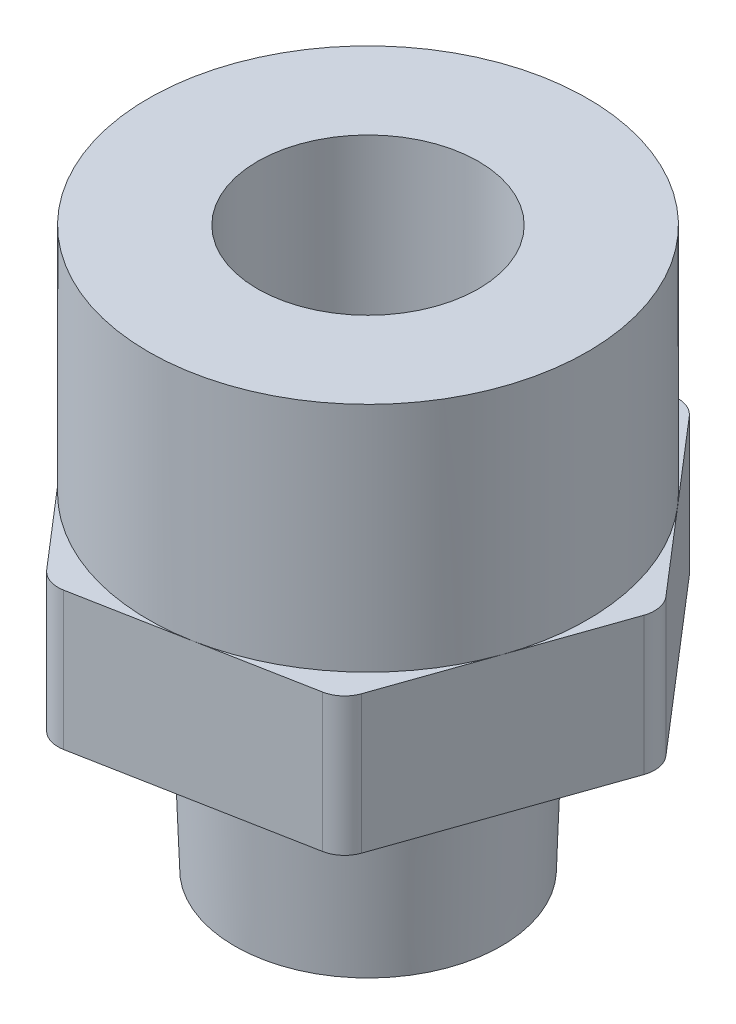
ISO-10303-21;
HEADER;
FILE_DESCRIPTION(('STEP AP214'),'2;1');
FILE_NAME('part.step','',(''),(''),'','','');
FILE_SCHEMA(('AUTOMOTIVE_DESIGN { 1 0 10303 214 1 1 1 1 }'));
ENDSEC;
DATA;
#1=APPLICATION_CONTEXT('core data for automotive mechanical design processes');
#2=APPLICATION_PROTOCOL_DEFINITION('international standard','automotive_design',2000,#1);
#3=PRODUCT_CONTEXT('',#1,'mechanical');
#4=PRODUCT('Part','Part','',(#3));
#5=PRODUCT_RELATED_PRODUCT_CATEGORY('part','',(#4));
#6=PRODUCT_DEFINITION_FORMATION('','',#4);
#7=PRODUCT_DEFINITION_CONTEXT('part definition',#1,'design');
#8=PRODUCT_DEFINITION('design','',#6,#7);
#9=PRODUCT_DEFINITION_SHAPE('','',#8);
#10=(LENGTH_UNIT() NAMED_UNIT(*) SI_UNIT(.MILLI.,.METRE.));
#11=(NAMED_UNIT(*) PLANE_ANGLE_UNIT() SI_UNIT($,.RADIAN.));
#12=(NAMED_UNIT(*) SI_UNIT($,.STERADIAN.) SOLID_ANGLE_UNIT());
#13=UNCERTAINTY_MEASURE_WITH_UNIT(LENGTH_MEASURE(1.E-05),#10,'distance_accuracy_value','');
#14=(GEOMETRIC_REPRESENTATION_CONTEXT(3) GLOBAL_UNCERTAINTY_ASSIGNED_CONTEXT((#13)) GLOBAL_UNIT_ASSIGNED_CONTEXT((#10,
#11,#12)) REPRESENTATION_CONTEXT('',''));
#15=CARTESIAN_POINT('',(0.,0.,0.));
#16=DIRECTION('',(0.,0.,1.));
#17=DIRECTION('',(1.,0.,0.));
#18=AXIS2_PLACEMENT_3D('',#15,#16,#17);
#19=CARTESIAN_POINT('',(0.,12.7,0.));
#20=DIRECTION('',(0.,1.,0.));
#21=DIRECTION('',(0.,0.,1.));
#22=AXIS2_PLACEMENT_3D('',#19,#20,#21);
#23=PLANE('',#22);
#24=DIRECTION('',(0.982547848172458,0.,-0.186010015998258));
#25=VECTOR('',#24,1.);
#26=CARTESIAN_POINT('',(-7.69886897270267,12.7,22.0091741903497));
#27=LINE('',#26,#25);
#28=CARTESIAN_POINT('',(3.75610025305283,12.7,19.8405886981465));
#29=VERTEX_POINT('',#28);
#30=CARTESIAN_POINT('',(13.7701928466378,12.7,17.9447812552769));
#31=VERTEX_POINT('',#30);
#32=EDGE_CURVE('E157',#29,#31,#27,.T.);
#33=ORIENTED_EDGE('',*,*,#32,.T.);
#34=CARTESIAN_POINT('',(13.2977274060023,12.7,15.4491097209189));
#35=DIRECTION('',(0.,1.,0.));
#36=DIRECTION('',(0.,0.,1.));
#37=AXIS2_PLACEMENT_3D('',#34,#35,#36);
#38=CIRCLE('',#37,2.54);
#39=CARTESIAN_POINT('',(15.6952750745758,12.7,16.2877784140973));
#40=VERTEX_POINT('',#39);
#41=EDGE_CURVE('E248',#31,#40,#38,.T.);
#42=ORIENTED_EDGE('',*,*,#41,.T.);
#43=DIRECTION('',(0.330184524873388,0.,-0.943916404950213));
#44=VECTOR('',#43,1.);
#45=CARTESIAN_POINT('',(15.2110694788083,12.7,17.6720032059432));
#46=LINE('',#45,#44);
#47=CARTESIAN_POINT('',(19.0605039651597,12.7,6.66741611076832));
#48=VERTEX_POINT('',#47);
#49=EDGE_CURVE('E171',#40,#48,#46,.T.);
#50=ORIENTED_EDGE('',*,*,#49,.T.);
#51=CARTESIAN_POINT('',(0.,12.7,0.));
#52=DIRECTION('',(0.,1.,0.));
#53=DIRECTION('',(0.,0.,1.));
#54=AXIS2_PLACEMENT_3D('',#51,#52,#53);
#55=CIRCLE('',#54,20.193);
#56=EDGE_CURVE('E169',#29,#48,#55,.T.);
#57=ORIENTED_EDGE('',*,*,#56,.F.);
#58=EDGE_LOOP('',(#33,#42,#50,#57));
#59=FACE_BOUND('',#58,.T.);
#60=ADVANCED_FACE('F36',(#59),#23,.T.);
#61=CARTESIAN_POINT('',(22.4257328557435,12.7,-2.95294619256065));
#62=VERTEX_POINT('',#61);
#63=EDGE_CURVE('E156',#48,#62,#46,.T.);
#64=ORIENTED_EDGE('',*,*,#63,.T.);
#65=CARTESIAN_POINT('',(20.02818518717,12.7,-3.79161488573905));
#66=DIRECTION('',(0.,1.,0.));
#67=DIRECTION('',(0.,0.,1.));
#68=AXIS2_PLACEMENT_3D('',#65,#66,#67);
#69=CIRCLE('',#68,2.54);
#70=CARTESIAN_POINT('',(21.953267415108,12.7,-5.44861772691869));
#71=VERTEX_POINT('',#70);
#72=EDGE_CURVE('E255',#62,#71,#69,.T.);
#73=ORIENTED_EDGE('',*,*,#72,.T.);
#74=DIRECTION('',(-0.65236332329907,0.,-0.757906388951956));
#75=VECTOR('',#74,1.);
#76=CARTESIAN_POINT('',(22.909938451511,12.7,-4.33717098440654));
#77=LINE('',#76,#75);
#78=CARTESIAN_POINT('',(15.3044037121068,12.7,-13.1731725873781));
#79=VERTEX_POINT('',#78);
#80=EDGE_CURVE('E193',#71,#79,#77,.T.);
#81=ORIENTED_EDGE('',*,*,#80,.T.);
#82=EDGE_CURVE('E178',#48,#79,#55,.T.);
#83=ORIENTED_EDGE('',*,*,#82,.F.);
#84=EDGE_LOOP('',(#64,#73,#81,#83));
#85=FACE_BOUND('',#84,.T.);
#86=ADVANCED_FACE('F293',(#85),#23,.T.);
#87=CARTESIAN_POINT('',(8.65554000910572,12.7,-20.8977274478376));
#88=VERTEX_POINT('',#87);
#89=EDGE_CURVE('E192',#79,#88,#77,.T.);
#90=ORIENTED_EDGE('',*,*,#89,.T.);
#91=CARTESIAN_POINT('',(6.73045778116775,12.7,-19.2407246066579));
#92=DIRECTION('',(0.,1.,0.));
#93=DIRECTION('',(0.,0.,1.));
#94=AXIS2_PLACEMENT_3D('',#91,#92,#93);
#95=CIRCLE('',#94,2.54);
#96=CARTESIAN_POINT('',(6.25799234053218,12.7,-21.736396141016));
#97=VERTEX_POINT('',#96);
#98=EDGE_CURVE('E262',#88,#97,#95,.T.);
#99=ORIENTED_EDGE('',*,*,#98,.T.);
#100=DIRECTION('',(-0.982547848172458,0.,0.186010015998258));
#101=VECTOR('',#100,1.);
#102=CARTESIAN_POINT('',(7.69886897270268,12.7,-22.0091741903497));
#103=LINE('',#102,#101);
#104=CARTESIAN_POINT('',(-3.75610025305282,12.7,-19.8405886981465));
#105=VERTEX_POINT('',#104);
#106=EDGE_CURVE('E196',#97,#105,#103,.T.);
#107=ORIENTED_EDGE('',*,*,#106,.T.);
#108=EDGE_CURVE('E288',#79,#105,#55,.T.);
#109=ORIENTED_EDGE('',*,*,#108,.F.);
#110=EDGE_LOOP('',(#90,#99,#107,#109));
#111=FACE_BOUND('',#110,.T.);
#112=ADVANCED_FACE('F312',(#111),#23,.T.);
#113=CARTESIAN_POINT('',(-13.7701928466378,12.7,-17.9447812552769));
#114=VERTEX_POINT('',#113);
#115=EDGE_CURVE('E195',#105,#114,#103,.T.);
#116=ORIENTED_EDGE('',*,*,#115,.T.);
#117=CARTESIAN_POINT('',(-13.2977274060022,12.7,-15.4491097209189));
#118=DIRECTION('',(0.,1.,0.));
#119=DIRECTION('',(0.,0.,1.));
#120=AXIS2_PLACEMENT_3D('',#117,#118,#119);
#121=CIRCLE('',#120,2.54);
#122=CARTESIAN_POINT('',(-15.6952750745758,12.7,-16.2877784140973));
#123=VERTEX_POINT('',#122);
#124=EDGE_CURVE('E44',#114,#123,#121,.T.);
#125=ORIENTED_EDGE('',*,*,#124,.T.);
#126=DIRECTION('',(-0.330184524873388,0.,0.943916404950213));
#127=VECTOR('',#126,1.);
#128=CARTESIAN_POINT('',(-15.2110694788083,12.7,-17.6720032059432));
#129=LINE('',#128,#127);
#130=CARTESIAN_POINT('',(-19.0605039651597,12.7,-6.66741611076832));
#131=VERTEX_POINT('',#130);
#132=EDGE_CURVE('E199',#123,#131,#129,.T.);
#133=ORIENTED_EDGE('',*,*,#132,.T.);
#134=EDGE_CURVE('E185',#105,#131,#55,.T.);
#135=ORIENTED_EDGE('',*,*,#134,.F.);
#136=EDGE_LOOP('',(#116,#125,#133,#135));
#137=FACE_BOUND('',#136,.T.);
#138=ADVANCED_FACE('F348',(#137),#23,.T.);
#139=CARTESIAN_POINT('',(-22.4257328557435,12.7,2.95294619256064));
#140=VERTEX_POINT('',#139);
#141=EDGE_CURVE('E198',#131,#140,#129,.T.);
#142=ORIENTED_EDGE('',*,*,#141,.T.);
#143=CARTESIAN_POINT('',(-20.02818518717,12.7,3.79161488573905));
#144=DIRECTION('',(0.,1.,0.));
#145=DIRECTION('',(0.,0.,1.));
#146=AXIS2_PLACEMENT_3D('',#143,#144,#145);
#147=CIRCLE('',#146,2.54);
#148=CARTESIAN_POINT('',(-21.953267415108,12.7,5.44861772691869));
#149=VERTEX_POINT('',#148);
#150=EDGE_CURVE('E11',#140,#149,#147,.T.);
#151=ORIENTED_EDGE('',*,*,#150,.T.);
#152=DIRECTION('',(0.65236332329907,0.,0.757906388951955));
#153=VECTOR('',#152,1.);
#154=CARTESIAN_POINT('',(-22.909938451511,12.7,4.33717098440654));
#155=LINE('',#154,#153);
#156=CARTESIAN_POINT('',(-15.3044037121068,12.7,13.1731725873781));
#157=VERTEX_POINT('',#156);
#158=EDGE_CURVE('E184',#149,#157,#155,.T.);
#159=ORIENTED_EDGE('',*,*,#158,.T.);
#160=EDGE_CURVE('E183',#131,#157,#55,.T.);
#161=ORIENTED_EDGE('',*,*,#160,.F.);
#162=EDGE_LOOP('',(#142,#151,#159,#161));
#163=FACE_BOUND('',#162,.T.);
#164=ADVANCED_FACE('F284',(#163),#23,.T.);
#165=CARTESIAN_POINT('',(-7.69886897270267,12.7,22.0091741903497));
#166=DIRECTION('',(-0.186010015998258,0.,-0.982547848172458));
#167=DIRECTION('',(-0.982547848172458,0.,0.186010015998258));
#168=AXIS2_PLACEMENT_3D('',#165,#166,#167);
#169=PLANE('',#168);
#170=CARTESIAN_POINT('',(-6.25799234053217,12.7,21.736396141016));
#171=VERTEX_POINT('',#170);
#172=EDGE_CURVE('E144',#171,#29,#27,.T.);
#173=ORIENTED_EDGE('',*,*,#172,.F.);
#174=DIRECTION('',(0.,-1.,0.));
#175=VECTOR('',#174,1.);
#176=CARTESIAN_POINT('',(-6.25799234053217,12.7,21.736396141016));
#177=LINE('',#176,#175);
#178=CARTESIAN_POINT('',(-6.25799234053217,0.,21.736396141016));
#179=VERTEX_POINT('',#178);
#180=EDGE_CURVE('E223',#171,#179,#177,.T.);
#181=ORIENTED_EDGE('',*,*,#180,.T.);
#182=DIRECTION('',(0.982547848172458,0.,-0.186010015998258));
#183=VECTOR('',#182,1.);
#184=CARTESIAN_POINT('',(-7.69886897270267,0.,22.0091741903497));
#185=LINE('',#184,#183);
#186=CARTESIAN_POINT('',(13.7701928466378,0.,17.9447812552769));
#187=VERTEX_POINT('',#186);
#188=EDGE_CURVE('E201',#179,#187,#185,.T.);
#189=ORIENTED_EDGE('',*,*,#188,.T.);
#190=DIRECTION('',(0.,-1.,0.));
#191=VECTOR('',#190,1.);
#192=CARTESIAN_POINT('',(13.7701928466378,12.7,17.9447812552769));
#193=LINE('',#192,#191);
#194=EDGE_CURVE('E164',#187,#31,#193,.F.);
#195=ORIENTED_EDGE('',*,*,#194,.T.);
#196=ORIENTED_EDGE('',*,*,#32,.F.);
#197=EDGE_LOOP('',(#173,#181,#189,#195,#196));
#198=FACE_BOUND('',#197,.T.);
#199=ADVANCED_FACE('F161',(#198),#169,.F.);
#200=CARTESIAN_POINT('',(15.2110694788083,12.7,17.6720032059432));
#201=DIRECTION('',(-0.943916404950213,0.,-0.330184524873388));
#202=DIRECTION('',(-0.330184524873388,0.,0.943916404950214));
#203=AXIS2_PLACEMENT_3D('',#200,#201,#202);
#204=PLANE('',#203);
#205=ORIENTED_EDGE('',*,*,#49,.F.);
#206=DIRECTION('',(0.,-1.,0.));
#207=VECTOR('',#206,1.);
#208=CARTESIAN_POINT('',(15.6952750745758,12.7,16.2877784140973));
#209=LINE('',#208,#207);
#210=CARTESIAN_POINT('',(15.6952750745758,0.,16.2877784140973));
#211=VERTEX_POINT('',#210);
#212=EDGE_CURVE('E245',#40,#211,#209,.T.);
#213=ORIENTED_EDGE('',*,*,#212,.T.);
#214=DIRECTION('',(0.330184524873388,0.,-0.943916404950213));
#215=VECTOR('',#214,1.);
#216=CARTESIAN_POINT('',(15.2110694788083,0.,17.6720032059432));
#217=LINE('',#216,#215);
#218=CARTESIAN_POINT('',(22.4257328557435,0.,-2.95294619256065));
#219=VERTEX_POINT('',#218);
#220=EDGE_CURVE('E203',#211,#219,#217,.T.);
#221=ORIENTED_EDGE('',*,*,#220,.T.);
#222=DIRECTION('',(0.,-1.,0.));
#223=VECTOR('',#222,1.);
#224=CARTESIAN_POINT('',(22.4257328557435,12.7,-2.95294619256065));
#225=LINE('',#224,#223);
#226=EDGE_CURVE('E243',#219,#62,#225,.F.);
#227=ORIENTED_EDGE('',*,*,#226,.T.);
#228=ORIENTED_EDGE('',*,*,#63,.F.);
#229=EDGE_LOOP('',(#205,#213,#221,#227,#228));
#230=FACE_BOUND('',#229,.T.);
#231=ADVANCED_FACE('F297',(#230),#204,.F.);
#232=CARTESIAN_POINT('',(22.909938451511,12.7,-4.33717098440654));
#233=DIRECTION('',(-0.757906388951955,0.,0.65236332329907));
#234=DIRECTION('',(0.65236332329907,0.,0.757906388951956));
#235=AXIS2_PLACEMENT_3D('',#232,#233,#234);
#236=PLANE('',#235);
#237=ORIENTED_EDGE('',*,*,#80,.F.);
#238=DIRECTION('',(0.,-1.,0.));
#239=VECTOR('',#238,1.);
#240=CARTESIAN_POINT('',(21.953267415108,12.7,-5.44861772691869));
#241=LINE('',#240,#239);
#242=CARTESIAN_POINT('',(21.953267415108,0.,-5.44861772691869));
#243=VERTEX_POINT('',#242);
#244=EDGE_CURVE('E252',#71,#243,#241,.T.);
#245=ORIENTED_EDGE('',*,*,#244,.T.);
#246=DIRECTION('',(-0.65236332329907,0.,-0.757906388951956));
#247=VECTOR('',#246,1.);
#248=CARTESIAN_POINT('',(22.909938451511,0.,-4.33717098440654));
#249=LINE('',#248,#247);
#250=CARTESIAN_POINT('',(8.65554000910572,0.,-20.8977274478376));
#251=VERTEX_POINT('',#250);
#252=EDGE_CURVE('E206',#243,#251,#249,.T.);
#253=ORIENTED_EDGE('',*,*,#252,.T.);
#254=DIRECTION('',(0.,-1.,0.));
#255=VECTOR('',#254,1.);
#256=CARTESIAN_POINT('',(8.65554000910572,12.7,-20.8977274478376));
#257=LINE('',#256,#255);
#258=EDGE_CURVE('E250',#251,#88,#257,.F.);
#259=ORIENTED_EDGE('',*,*,#258,.T.);
#260=ORIENTED_EDGE('',*,*,#89,.F.);
#261=EDGE_LOOP('',(#237,#245,#253,#259,#260));
#262=FACE_BOUND('',#261,.T.);
#263=ADVANCED_FACE('F306',(#262),#236,.F.);
#264=CARTESIAN_POINT('',(7.69886897270268,12.7,-22.0091741903497));
#265=DIRECTION('',(0.186010015998258,0.,0.982547848172458));
#266=DIRECTION('',(0.982547848172458,0.,-0.186010015998258));
#267=AXIS2_PLACEMENT_3D('',#264,#265,#266);
#268=PLANE('',#267);
#269=ORIENTED_EDGE('',*,*,#106,.F.);
#270=DIRECTION('',(0.,-1.,0.));
#271=VECTOR('',#270,1.);
#272=CARTESIAN_POINT('',(6.25799234053218,12.7,-21.736396141016));
#273=LINE('',#272,#271);
#274=CARTESIAN_POINT('',(6.25799234053218,0.,-21.736396141016));
#275=VERTEX_POINT('',#274);
#276=EDGE_CURVE('E259',#97,#275,#273,.T.);
#277=ORIENTED_EDGE('',*,*,#276,.T.);
#278=DIRECTION('',(-0.982547848172458,0.,0.186010015998258));
#279=VECTOR('',#278,1.);
#280=CARTESIAN_POINT('',(7.69886897270268,0.,-22.0091741903497));
#281=LINE('',#280,#279);
#282=CARTESIAN_POINT('',(-13.7701928466378,0.,-17.9447812552769));
#283=VERTEX_POINT('',#282);
#284=EDGE_CURVE('E209',#275,#283,#281,.T.);
#285=ORIENTED_EDGE('',*,*,#284,.T.);
#286=DIRECTION('',(0.,-1.,0.));
#287=VECTOR('',#286,1.);
#288=CARTESIAN_POINT('',(-13.7701928466378,12.7,-17.9447812552769));
#289=LINE('',#288,#287);
#290=EDGE_CURVE('E257',#283,#114,#289,.F.);
#291=ORIENTED_EDGE('',*,*,#290,.T.);
#292=ORIENTED_EDGE('',*,*,#115,.F.);
#293=EDGE_LOOP('',(#269,#277,#285,#291,#292));
#294=FACE_BOUND('',#293,.T.);
#295=ADVANCED_FACE('F318',(#294),#268,.F.);
#296=CARTESIAN_POINT('',(-15.2110694788083,12.7,-17.6720032059432));
#297=DIRECTION('',(0.943916404950213,0.,0.330184524873388));
#298=DIRECTION('',(0.330184524873388,0.,-0.943916404950214));
#299=AXIS2_PLACEMENT_3D('',#296,#297,#298);
#300=PLANE('',#299);
#301=ORIENTED_EDGE('',*,*,#132,.F.);
#302=DIRECTION('',(0.,-1.,0.));
#303=VECTOR('',#302,1.);
#304=CARTESIAN_POINT('',(-15.6952750745758,12.7,-16.2877784140973));
#305=LINE('',#304,#303);
#306=CARTESIAN_POINT('',(-15.6952750745758,0.,-16.2877784140973));
#307=VERTEX_POINT('',#306);
#308=EDGE_CURVE('E265',#123,#307,#305,.T.);
#309=ORIENTED_EDGE('',*,*,#308,.T.);
#310=DIRECTION('',(-0.330184524873388,0.,0.943916404950213));
#311=VECTOR('',#310,1.);
#312=CARTESIAN_POINT('',(-15.2110694788083,0.,-17.6720032059432));
#313=LINE('',#312,#311);
#314=CARTESIAN_POINT('',(-22.4257328557435,0.,2.95294619256064));
#315=VERTEX_POINT('',#314);
#316=EDGE_CURVE('E212',#307,#315,#313,.T.);
#317=ORIENTED_EDGE('',*,*,#316,.T.);
#318=DIRECTION('',(0.,-1.,0.));
#319=VECTOR('',#318,1.);
#320=CARTESIAN_POINT('',(-22.4257328557435,12.7,2.95294619256064));
#321=LINE('',#320,#319);
#322=EDGE_CURVE('E58',#315,#140,#321,.F.);
#323=ORIENTED_EDGE('',*,*,#322,.T.);
#324=ORIENTED_EDGE('',*,*,#141,.F.);
#325=EDGE_LOOP('',(#301,#309,#317,#323,#324));
#326=FACE_BOUND('',#325,.T.);
#327=ADVANCED_FACE('F269',(#326),#300,.F.);
#328=CARTESIAN_POINT('',(-22.909938451511,12.7,4.33717098440654));
#329=DIRECTION('',(0.757906388951956,0.,-0.65236332329907));
#330=DIRECTION('',(-0.65236332329907,0.,-0.757906388951955));
#331=AXIS2_PLACEMENT_3D('',#328,#329,#330);
#332=PLANE('',#331);
#333=DIRECTION('',(0.65236332329907,0.,0.757906388951955));
#334=VECTOR('',#333,1.);
#335=CARTESIAN_POINT('',(-22.909938451511,0.,4.33717098440654));
#336=LINE('',#335,#334);
#337=CARTESIAN_POINT('',(-21.953267415108,0.,5.44861772691869));
#338=VERTEX_POINT('',#337);
#339=CARTESIAN_POINT('',(-8.65554000910572,0.,20.8977274478376));
#340=VERTEX_POINT('',#339);
#341=EDGE_CURVE('E167',#338,#340,#336,.T.);
#342=ORIENTED_EDGE('',*,*,#341,.T.);
#343=DIRECTION('',(0.,-1.,0.));
#344=VECTOR('',#343,1.);
#345=CARTESIAN_POINT('',(-8.65554000910572,12.7,20.8977274478376));
#346=LINE('',#345,#344);
#347=CARTESIAN_POINT('',(-8.65554000910572,12.7,20.8977274478376));
#348=VERTEX_POINT('',#347);
#349=EDGE_CURVE('E240',#340,#348,#346,.F.);
#350=ORIENTED_EDGE('',*,*,#349,.T.);
#351=EDGE_CURVE('E186',#157,#348,#155,.T.);
#352=ORIENTED_EDGE('',*,*,#351,.F.);
#353=ORIENTED_EDGE('',*,*,#158,.F.);
#354=DIRECTION('',(0.,-1.,0.));
#355=VECTOR('',#354,1.);
#356=CARTESIAN_POINT('',(-21.953267415108,12.7,5.44861772691869));
#357=LINE('',#356,#355);
#358=EDGE_CURVE('E237',#149,#338,#357,.T.);
#359=ORIENTED_EDGE('',*,*,#358,.T.);
#360=EDGE_LOOP('',(#342,#350,#352,#353,#359));
#361=FACE_BOUND('',#360,.T.);
#362=ADVANCED_FACE('F281',(#361),#332,.F.);
#363=ORIENTED_EDGE('',*,*,#351,.T.);
#364=CARTESIAN_POINT('',(-6.73045778116775,12.7,19.2407246066579));
#365=DIRECTION('',(0.,1.,0.));
#366=DIRECTION('',(0.,0.,1.));
#367=AXIS2_PLACEMENT_3D('',#364,#365,#366);
#368=CIRCLE('',#367,2.54);
#369=EDGE_CURVE('E152',#348,#171,#368,.T.);
#370=ORIENTED_EDGE('',*,*,#369,.T.);
#371=ORIENTED_EDGE('',*,*,#172,.T.);
#372=EDGE_CURVE('E149',#157,#29,#55,.T.);
#373=ORIENTED_EDGE('',*,*,#372,.F.);
#374=EDGE_LOOP('',(#363,#370,#371,#373));
#375=FACE_BOUND('',#374,.T.);
#376=ADVANCED_FACE('F147',(#375),#23,.T.);
#377=CARTESIAN_POINT('',(0.,0.,0.));
#378=DIRECTION('',(0.,1.,0.));
#379=DIRECTION('',(0.,0.,1.));
#380=AXIS2_PLACEMENT_3D('',#377,#378,#379);
#381=PLANE('',#380);
#382=CARTESIAN_POINT('',(0.,0.,0.));
#383=DIRECTION('',(0.,1.,0.));
#384=DIRECTION('',(0.,0.,1.));
#385=AXIS2_PLACEMENT_3D('',#382,#383,#384);
#386=CIRCLE('',#385,14.859);
#387=CARTESIAN_POINT('',(0.,0.,14.859));
#388=VERTEX_POINT('',#387);
#389=EDGE_CURVE('E216',#388,#388,#386,.F.);
#390=ORIENTED_EDGE('',*,*,#389,.F.);
#391=EDGE_LOOP('',(#390));
#392=FACE_BOUND('',#391,.T.);
#393=ORIENTED_EDGE('',*,*,#188,.F.);
#394=CARTESIAN_POINT('',(-6.73045778116775,0.,19.2407246066579));
#395=DIRECTION('',(0.,1.,0.));
#396=DIRECTION('',(0.,0.,1.));
#397=AXIS2_PLACEMENT_3D('',#394,#395,#396);
#398=CIRCLE('',#397,2.54);
#399=EDGE_CURVE('E235',#179,#340,#398,.F.);
#400=ORIENTED_EDGE('',*,*,#399,.T.);
#401=ORIENTED_EDGE('',*,*,#341,.F.);
#402=CARTESIAN_POINT('',(-20.02818518717,0.,3.79161488573905));
#403=DIRECTION('',(0.,1.,0.));
#404=DIRECTION('',(0.,0.,1.));
#405=AXIS2_PLACEMENT_3D('',#402,#403,#404);
#406=CIRCLE('',#405,2.54);
#407=EDGE_CURVE('E225',#338,#315,#406,.F.);
#408=ORIENTED_EDGE('',*,*,#407,.T.);
#409=ORIENTED_EDGE('',*,*,#316,.F.);
#410=CARTESIAN_POINT('',(-13.2977274060022,0.,-15.4491097209189));
#411=DIRECTION('',(0.,1.,0.));
#412=DIRECTION('',(0.,0.,1.));
#413=AXIS2_PLACEMENT_3D('',#410,#411,#412);
#414=CIRCLE('',#413,2.54);
#415=EDGE_CURVE('E227',#307,#283,#414,.F.);
#416=ORIENTED_EDGE('',*,*,#415,.T.);
#417=ORIENTED_EDGE('',*,*,#284,.F.);
#418=CARTESIAN_POINT('',(6.73045778116775,0.,-19.2407246066579));
#419=DIRECTION('',(0.,1.,0.));
#420=DIRECTION('',(0.,0.,1.));
#421=AXIS2_PLACEMENT_3D('',#418,#419,#420);
#422=CIRCLE('',#421,2.54);
#423=EDGE_CURVE('E229',#275,#251,#422,.F.);
#424=ORIENTED_EDGE('',*,*,#423,.T.);
#425=ORIENTED_EDGE('',*,*,#252,.F.);
#426=CARTESIAN_POINT('',(20.02818518717,0.,-3.79161488573905));
#427=DIRECTION('',(0.,1.,0.));
#428=DIRECTION('',(0.,0.,1.));
#429=AXIS2_PLACEMENT_3D('',#426,#427,#428);
#430=CIRCLE('',#429,2.54);
#431=EDGE_CURVE('E231',#243,#219,#430,.F.);
#432=ORIENTED_EDGE('',*,*,#431,.T.);
#433=ORIENTED_EDGE('',*,*,#220,.F.);
#434=CARTESIAN_POINT('',(13.2977274060023,0.,15.4491097209189));
#435=DIRECTION('',(0.,1.,0.));
#436=DIRECTION('',(0.,0.,1.));
#437=AXIS2_PLACEMENT_3D('',#434,#435,#436);
#438=CIRCLE('',#437,2.54);
#439=EDGE_CURVE('E233',#211,#187,#438,.F.);
#440=ORIENTED_EDGE('',*,*,#439,.T.);
#441=EDGE_LOOP('',(#393,#400,#401,#408,#409,#416,#417,#424,#425,#432,#433,#440));
#442=FACE_BOUND('',#441,.T.);
#443=ADVANCED_FACE('F273',(#392,#442),#381,.F.);
#444=CARTESIAN_POINT('',(0.,34.036,0.));
#445=DIRECTION('',(0.,-1.,0.));
#446=DIRECTION('',(0.,0.,-1.));
#447=AXIS2_PLACEMENT_3D('',#444,#445,#446);
#448=CYLINDRICAL_SURFACE('',#447,20.193);
#449=CARTESIAN_POINT('',(0.,34.036,0.));
#450=DIRECTION('',(0.,1.,0.));
#451=DIRECTION('',(0.,0.,1.));
#452=AXIS2_PLACEMENT_3D('',#449,#450,#451);
#453=CIRCLE('',#452,20.193);
#454=CARTESIAN_POINT('',(0.,34.036,20.193));
#455=VERTEX_POINT('',#454);
#456=EDGE_CURVE('E175',#455,#455,#453,.T.);
#457=ORIENTED_EDGE('',*,*,#456,.F.);
#458=EDGE_LOOP('',(#457));
#459=FACE_BOUND('',#458,.T.);
#460=ORIENTED_EDGE('',*,*,#56,.T.);
#461=ORIENTED_EDGE('',*,*,#82,.T.);
#462=ORIENTED_EDGE('',*,*,#108,.T.);
#463=ORIENTED_EDGE('',*,*,#134,.T.);
#464=ORIENTED_EDGE('',*,*,#160,.T.);
#465=ORIENTED_EDGE('',*,*,#372,.T.);
#466=EDGE_LOOP('',(#460,#461,#462,#463,#464,#465));
#467=FACE_BOUND('',#466,.T.);
#468=ADVANCED_FACE('F180',(#459,#467),#448,.T.);
#469=CARTESIAN_POINT('',(0.,34.036,0.));
#470=DIRECTION('',(0.,1.,0.));
#471=DIRECTION('',(0.,0.,1.));
#472=AXIS2_PLACEMENT_3D('',#469,#470,#471);
#473=PLANE('',#472);
#474=CARTESIAN_POINT('',(0.,34.036,0.));
#475=DIRECTION('',(0.,-1.,0.));
#476=DIRECTION('',(0.,0.,-1.));
#477=AXIS2_PLACEMENT_3D('',#474,#475,#476);
#478=CIRCLE('',#477,10.16);
#479=CARTESIAN_POINT('',(0.,34.036,-10.16));
#480=VERTEX_POINT('',#479);
#481=EDGE_CURVE('E598',#480,#480,#478,.T.);
#482=ORIENTED_EDGE('',*,*,#481,.T.);
#483=EDGE_LOOP('',(#482));
#484=FACE_BOUND('',#483,.T.);
#485=ORIENTED_EDGE('',*,*,#456,.T.);
#486=EDGE_LOOP('',(#485));
#487=FACE_BOUND('',#486,.T.);
#488=ADVANCED_FACE('F432',(#484,#487),#473,.T.);
#489=CARTESIAN_POINT('',(0.,-4.572,0.));
#490=DIRECTION('',(0.,1.,0.));
#491=DIRECTION('',(0.,0.,1.));
#492=AXIS2_PLACEMENT_3D('',#489,#490,#491);
#493=CYLINDRICAL_SURFACE('',#492,14.859);
#494=CARTESIAN_POINT('',(0.,-2.06073756847278,0.));
#495=DIRECTION('',(0.,-1.,0.));
#496=DIRECTION('',(0.,0.,-1.));
#497=AXIS2_PLACEMENT_3D('',#494,#495,#496);
#498=CIRCLE('',#497,14.859);
#499=CARTESIAN_POINT('',(0.,-2.06073756847278,-14.859));
#500=VERTEX_POINT('',#499);
#501=EDGE_CURVE('E219',#500,#500,#498,.F.);
#502=ORIENTED_EDGE('',*,*,#501,.T.);
#503=EDGE_LOOP('',(#502));
#504=FACE_BOUND('',#503,.T.);
#505=ORIENTED_EDGE('',*,*,#389,.T.);
#506=EDGE_LOOP('',(#505));
#507=FACE_BOUND('',#506,.T.);
#508=ADVANCED_FACE('F422',(#504,#507),#493,.T.);
#509=CARTESIAN_POINT('',(0.,-4.572,0.));
#510=DIRECTION('',(0.,1.,0.));
#511=DIRECTION('',(0.,0.,-1.));
#512=AXIS2_PLACEMENT_3D('',#509,#510,#511);
#513=CONICAL_SURFACE('',#512,12.7,0.0349065850398866);
#514=CARTESIAN_POINT('',(0.,-17.272,0.));
#515=DIRECTION('',(0.,-1.,0.));
#516=DIRECTION('',(0.,0.,-1.));
#517=AXIS2_PLACEMENT_3D('',#514,#515,#516);
#518=CIRCLE('',#517,12.2565062274548);
#519=CARTESIAN_POINT('',(0.,-17.272,-12.2565062274548));
#520=VERTEX_POINT('',#519);
#521=EDGE_CURVE('E176',#520,#520,#518,.T.);
#522=ORIENTED_EDGE('',*,*,#521,.F.);
#523=EDGE_LOOP('',(#522));
#524=FACE_BOUND('',#523,.T.);
#525=CARTESIAN_POINT('',(0.,-4.572,0.));
#526=DIRECTION('',(0.,-1.,0.));
#527=DIRECTION('',(0.,0.,-1.));
#528=AXIS2_PLACEMENT_3D('',#525,#526,#527);
#529=CIRCLE('',#528,12.7);
#530=CARTESIAN_POINT('',(0.,-4.572,-12.7));
#531=VERTEX_POINT('',#530);
#532=EDGE_CURVE('E599',#531,#531,#529,.T.);
#533=ORIENTED_EDGE('',*,*,#532,.T.);
#534=EDGE_LOOP('',(#533));
#535=FACE_BOUND('',#534,.T.);
#536=ADVANCED_FACE('F411',(#524,#535),#513,.T.);
#537=CARTESIAN_POINT('',(0.,-17.272,0.));
#538=DIRECTION('',(0.,-1.,0.));
#539=DIRECTION('',(0.,0.,-1.));
#540=AXIS2_PLACEMENT_3D('',#537,#538,#539);
#541=PLANE('',#540);
#542=CARTESIAN_POINT('',(0.,-17.272,0.));
#543=DIRECTION('',(0.,-1.,0.));
#544=DIRECTION('',(0.,0.,-1.));
#545=AXIS2_PLACEMENT_3D('',#542,#543,#544);
#546=CIRCLE('',#545,10.16);
#547=CARTESIAN_POINT('',(0.,-17.272,-10.16));
#548=VERTEX_POINT('',#547);
#549=EDGE_CURVE('E600',#548,#548,#546,.T.);
#550=ORIENTED_EDGE('',*,*,#549,.F.);
#551=EDGE_LOOP('',(#550));
#552=FACE_BOUND('',#551,.T.);
#553=ORIENTED_EDGE('',*,*,#521,.T.);
#554=EDGE_LOOP('',(#553));
#555=FACE_BOUND('',#554,.T.);
#556=ADVANCED_FACE('F400',(#552,#555),#541,.T.);
#557=CARTESIAN_POINT('',(0.,34.036,0.));
#558=DIRECTION('',(0.,-1.,0.));
#559=DIRECTION('',(0.,0.,-1.));
#560=AXIS2_PLACEMENT_3D('',#557,#558,#559);
#561=CYLINDRICAL_SURFACE('',#560,10.16);
#562=ORIENTED_EDGE('',*,*,#481,.F.);
#563=EDGE_LOOP('',(#562));
#564=FACE_BOUND('',#563,.T.);
#565=ORIENTED_EDGE('',*,*,#549,.T.);
#566=EDGE_LOOP('',(#565));
#567=FACE_BOUND('',#566,.T.);
#568=ADVANCED_FACE('F389',(#564,#567),#561,.F.);
#569=CARTESIAN_POINT('',(0.,-2.06073756847278,0.));
#570=DIRECTION('',(0.,-1.,0.));
#571=DIRECTION('',(0.,0.,-1.));
#572=AXIS2_PLACEMENT_3D('',#569,#570,#571);
#573=TOROIDAL_SURFACE('',#572,12.319,2.54);
#574=ORIENTED_EDGE('',*,*,#501,.F.);
#575=EDGE_LOOP('',(#574));
#576=FACE_BOUND('',#575,.T.);
#577=ORIENTED_EDGE('',*,*,#532,.F.);
#578=EDGE_LOOP('',(#577));
#579=FACE_BOUND('',#578,.T.);
#580=ADVANCED_FACE('F330',(#576,#579),#573,.T.);
#581=CARTESIAN_POINT('',(-6.73045778116775,12.7,19.2407246066579));
#582=DIRECTION('',(0.,-1.,0.));
#583=DIRECTION('',(0.,0.,-1.));
#584=AXIS2_PLACEMENT_3D('',#581,#582,#583);
#585=CYLINDRICAL_SURFACE('',#584,2.54);
#586=ORIENTED_EDGE('',*,*,#369,.F.);
#587=ORIENTED_EDGE('',*,*,#349,.F.);
#588=ORIENTED_EDGE('',*,*,#399,.F.);
#589=ORIENTED_EDGE('',*,*,#180,.F.);
#590=EDGE_LOOP('',(#586,#587,#588,#589));
#591=FACE_BOUND('',#590,.T.);
#592=ADVANCED_FACE('F323',(#591),#585,.T.);
#593=CARTESIAN_POINT('',(13.2977274060023,12.7,15.4491097209189));
#594=DIRECTION('',(0.,-1.,0.));
#595=DIRECTION('',(0.,0.,-1.));
#596=AXIS2_PLACEMENT_3D('',#593,#594,#595);
#597=CYLINDRICAL_SURFACE('',#596,2.54);
#598=ORIENTED_EDGE('',*,*,#41,.F.);
#599=ORIENTED_EDGE('',*,*,#194,.F.);
#600=ORIENTED_EDGE('',*,*,#439,.F.);
#601=ORIENTED_EDGE('',*,*,#212,.F.);
#602=EDGE_LOOP('',(#598,#599,#600,#601));
#603=FACE_BOUND('',#602,.T.);
#604=ADVANCED_FACE('F321',(#603),#597,.T.);
#605=CARTESIAN_POINT('',(20.02818518717,12.7,-3.79161488573905));
#606=DIRECTION('',(0.,-1.,0.));
#607=DIRECTION('',(0.,0.,-1.));
#608=AXIS2_PLACEMENT_3D('',#605,#606,#607);
#609=CYLINDRICAL_SURFACE('',#608,2.54);
#610=ORIENTED_EDGE('',*,*,#72,.F.);
#611=ORIENTED_EDGE('',*,*,#226,.F.);
#612=ORIENTED_EDGE('',*,*,#431,.F.);
#613=ORIENTED_EDGE('',*,*,#244,.F.);
#614=EDGE_LOOP('',(#610,#611,#612,#613));
#615=FACE_BOUND('',#614,.T.);
#616=ADVANCED_FACE('F302',(#615),#609,.T.);
#617=CARTESIAN_POINT('',(6.73045778116775,12.7,-19.2407246066579));
#618=DIRECTION('',(0.,-1.,0.));
#619=DIRECTION('',(0.,0.,-1.));
#620=AXIS2_PLACEMENT_3D('',#617,#618,#619);
#621=CYLINDRICAL_SURFACE('',#620,2.54);
#622=ORIENTED_EDGE('',*,*,#98,.F.);
#623=ORIENTED_EDGE('',*,*,#258,.F.);
#624=ORIENTED_EDGE('',*,*,#423,.F.);
#625=ORIENTED_EDGE('',*,*,#276,.F.);
#626=EDGE_LOOP('',(#622,#623,#624,#625));
#627=FACE_BOUND('',#626,.T.);
#628=ADVANCED_FACE('F316',(#627),#621,.T.);
#629=CARTESIAN_POINT('',(-13.2977274060022,12.7,-15.4491097209189));
#630=DIRECTION('',(0.,-1.,0.));
#631=DIRECTION('',(0.,0.,-1.));
#632=AXIS2_PLACEMENT_3D('',#629,#630,#631);
#633=CYLINDRICAL_SURFACE('',#632,2.54);
#634=ORIENTED_EDGE('',*,*,#124,.F.);
#635=ORIENTED_EDGE('',*,*,#290,.F.);
#636=ORIENTED_EDGE('',*,*,#415,.F.);
#637=ORIENTED_EDGE('',*,*,#308,.F.);
#638=EDGE_LOOP('',(#634,#635,#636,#637));
#639=FACE_BOUND('',#638,.T.);
#640=ADVANCED_FACE('F357',(#639),#633,.T.);
#641=CARTESIAN_POINT('',(-20.02818518717,12.7,3.79161488573905));
#642=DIRECTION('',(0.,-1.,0.));
#643=DIRECTION('',(0.,0.,-1.));
#644=AXIS2_PLACEMENT_3D('',#641,#642,#643);
#645=CYLINDRICAL_SURFACE('',#644,2.54);
#646=ORIENTED_EDGE('',*,*,#150,.F.);
#647=ORIENTED_EDGE('',*,*,#322,.F.);
#648=ORIENTED_EDGE('',*,*,#407,.F.);
#649=ORIENTED_EDGE('',*,*,#358,.F.);
#650=EDGE_LOOP('',(#646,#647,#648,#649));
#651=FACE_BOUND('',#650,.T.);
#652=ADVANCED_FACE('F38',(#651),#645,.T.);
#653=CLOSED_SHELL('',(#60,#86,#112,#138,#164,#199,#231,#263,#295,#327,#362,#376,#443,#468,#488,
#508,#536,#556,#568,#580,#592,#604,#616,#628,#640,#652));
#654=MANIFOLD_SOLID_BREP('B2',#653);
#655=ADVANCED_BREP_SHAPE_REPRESENTATION('',(#18,#654),#14);
#656=SHAPE_DEFINITION_REPRESENTATION(#9,#655);
ENDSEC;
END-ISO-10303-21;
